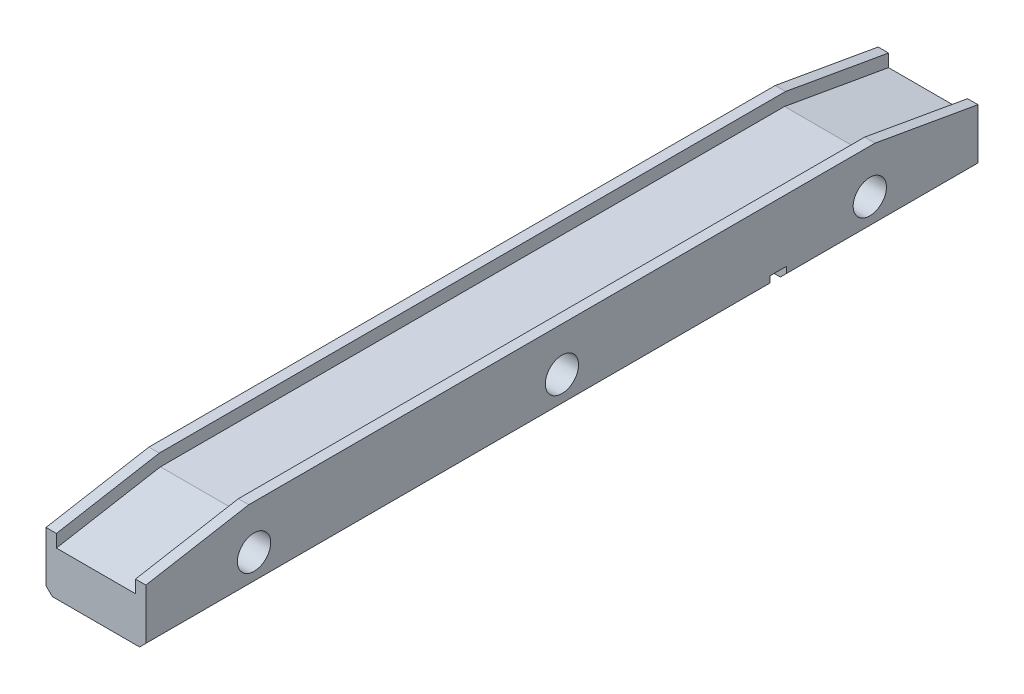
ISO-10303-21;
HEADER;
FILE_DESCRIPTION(('STEP AP214'),'2;1');
FILE_NAME('part.step','',(''),(''),'','','');
FILE_SCHEMA(('AUTOMOTIVE_DESIGN { 1 0 10303 214 1 1 1 1 }'));
ENDSEC;
DATA;
#1=APPLICATION_CONTEXT('core data for automotive mechanical design processes');
#2=APPLICATION_PROTOCOL_DEFINITION('international standard','automotive_design',2000,#1);
#3=PRODUCT_CONTEXT('',#1,'mechanical');
#4=PRODUCT('Part','Part','',(#3));
#5=PRODUCT_RELATED_PRODUCT_CATEGORY('part','',(#4));
#6=PRODUCT_DEFINITION_FORMATION('','',#4);
#7=PRODUCT_DEFINITION_CONTEXT('part definition',#1,'design');
#8=PRODUCT_DEFINITION('design','',#6,#7);
#9=PRODUCT_DEFINITION_SHAPE('','',#8);
#10=(LENGTH_UNIT() NAMED_UNIT(*) SI_UNIT(.MILLI.,.METRE.));
#11=(NAMED_UNIT(*) PLANE_ANGLE_UNIT() SI_UNIT($,.RADIAN.));
#12=(NAMED_UNIT(*) SI_UNIT($,.STERADIAN.) SOLID_ANGLE_UNIT());
#13=UNCERTAINTY_MEASURE_WITH_UNIT(LENGTH_MEASURE(1.E-05),#10,'distance_accuracy_value','');
#14=(GEOMETRIC_REPRESENTATION_CONTEXT(3) GLOBAL_UNCERTAINTY_ASSIGNED_CONTEXT((#13)) GLOBAL_UNIT_ASSIGNED_CONTEXT((#10,
#11,#12)) REPRESENTATION_CONTEXT('',''));
#15=CARTESIAN_POINT('',(0.,0.,0.));
#16=DIRECTION('',(0.,0.,1.));
#17=DIRECTION('',(1.,0.,0.));
#18=AXIS2_PLACEMENT_3D('',#15,#16,#17);
#19=CARTESIAN_POINT('',(24.,-30.,178.));
#20=DIRECTION('',(0.,1.,0.));
#21=DIRECTION('',(0.,0.,1.));
#22=AXIS2_PLACEMENT_3D('',#19,#20,#21);
#23=PLANE('',#22);
#24=DIRECTION('',(1.,0.,0.));
#25=VECTOR('',#24,1.);
#26=CARTESIAN_POINT('',(-24.,-30.,200.));
#27=LINE('',#26,#25);
#28=CARTESIAN_POINT('',(-21.,-30.,200.));
#29=VERTEX_POINT('',#28);
#30=CARTESIAN_POINT('',(21.,-30.,200.));
#31=VERTEX_POINT('',#30);
#32=EDGE_CURVE('E338',#29,#31,#27,.T.);
#33=ORIENTED_EDGE('',*,*,#32,.F.);
#34=DIRECTION('',(0.,0.,-1.));
#35=VECTOR('',#34,1.);
#36=CARTESIAN_POINT('',(-21.,-30.,178.));
#37=LINE('',#36,#35);
#38=CARTESIAN_POINT('',(-21.,-30.,-99.9999999999999));
#39=VERTEX_POINT('',#38);
#40=EDGE_CURVE('E257',#29,#39,#37,.T.);
#41=ORIENTED_EDGE('',*,*,#40,.T.);
#42=DIRECTION('',(1.,0.,0.));
#43=VECTOR('',#42,1.);
#44=CARTESIAN_POINT('',(24.,-30.,-99.9999999999999));
#45=LINE('',#44,#43);
#46=CARTESIAN_POINT('',(21.0000000000001,-30.,-99.9999999999999));
#47=VERTEX_POINT('',#46);
#48=EDGE_CURVE('E319',#39,#47,#45,.T.);
#49=ORIENTED_EDGE('',*,*,#48,.T.);
#50=DIRECTION('',(0.,0.,1.));
#51=VECTOR('',#50,1.);
#52=CARTESIAN_POINT('',(21.0000000000001,-30.,178.));
#53=LINE('',#52,#51);
#54=EDGE_CURVE('E255',#47,#31,#53,.T.);
#55=ORIENTED_EDGE('',*,*,#54,.T.);
#56=EDGE_LOOP('',(#33,#41,#49,#55));
#57=FACE_BOUND('',#56,.T.);
#58=ADVANCED_FACE('F41',(#57),#23,.F.);
#59=CARTESIAN_POINT('',(-24.,6.,178.));
#60=DIRECTION('',(1.,0.,0.));
#61=DIRECTION('',(0.,1.,0.));
#62=AXIS2_PLACEMENT_3D('',#59,#60,#61);
#63=PLANE('',#62);
#64=CARTESIAN_POINT('',(-24.,-15.,0.));
#65=DIRECTION('',(1.,0.,0.));
#66=DIRECTION('',(0.,1.,0.));
#67=AXIS2_PLACEMENT_3D('',#64,#65,#66);
#68=CIRCLE('',#67,8.);
#69=CARTESIAN_POINT('',(-24.,-7.,0.));
#70=VERTEX_POINT('',#69);
#71=EDGE_CURVE('E214',#70,#70,#68,.T.);
#72=ORIENTED_EDGE('',*,*,#71,.T.);
#73=EDGE_LOOP('',(#72));
#74=FACE_BOUND('',#73,.T.);
#75=CARTESIAN_POINT('',(-24.,-15.,148.));
#76=DIRECTION('',(1.,0.,0.));
#77=DIRECTION('',(0.,1.,0.));
#78=AXIS2_PLACEMENT_3D('',#75,#76,#77);
#79=CIRCLE('',#78,8.00000000000001);
#80=CARTESIAN_POINT('',(-24.,-6.99999999999999,148.));
#81=VERTEX_POINT('',#80);
#82=EDGE_CURVE('E356',#81,#81,#79,.T.);
#83=ORIENTED_EDGE('',*,*,#82,.T.);
#84=EDGE_LOOP('',(#83));
#85=FACE_BOUND('',#84,.T.);
#86=CARTESIAN_POINT('',(-24.,-15.,-148.));
#87=DIRECTION('',(1.,0.,0.));
#88=DIRECTION('',(0.,1.,0.));
#89=AXIS2_PLACEMENT_3D('',#86,#87,#88);
#90=CIRCLE('',#89,8.00000000000001);
#91=CARTESIAN_POINT('',(-24.,-6.99999999999999,-148.));
#92=VERTEX_POINT('',#91);
#93=EDGE_CURVE('E351',#92,#92,#90,.T.);
#94=ORIENTED_EDGE('',*,*,#93,.T.);
#95=EDGE_LOOP('',(#94));
#96=FACE_BOUND('',#95,.T.);
#97=DIRECTION('',(0.,-1.,0.));
#98=VECTOR('',#97,1.);
#99=CARTESIAN_POINT('',(-24.,6.00000000000012,-99.9999999999999));
#100=LINE('',#99,#98);
#101=CARTESIAN_POINT('',(-24.,-24.,-99.9999999999999));
#102=VERTEX_POINT('',#101);
#103=CARTESIAN_POINT('',(-24.,-27.,-99.9999999999999));
#104=VERTEX_POINT('',#103);
#105=EDGE_CURVE('E321',#102,#104,#100,.T.);
#106=ORIENTED_EDGE('',*,*,#105,.T.);
#107=DIRECTION('',(0.,0.,1.));
#108=VECTOR('',#107,1.);
#109=CARTESIAN_POINT('',(-24.,-27.,178.));
#110=LINE('',#109,#108);
#111=CARTESIAN_POINT('',(-24.,-27.,200.));
#112=VERTEX_POINT('',#111);
#113=EDGE_CURVE('E266',#104,#112,#110,.T.);
#114=ORIENTED_EDGE('',*,*,#113,.T.);
#115=DIRECTION('',(0.,-1.,0.));
#116=VECTOR('',#115,1.);
#117=CARTESIAN_POINT('',(-24.,6.,200.));
#118=LINE('',#117,#116);
#119=CARTESIAN_POINT('',(-24.,-2.72378936410881,200.));
#120=VERTEX_POINT('',#119);
#121=EDGE_CURVE('E335',#120,#112,#118,.T.);
#122=ORIENTED_EDGE('',*,*,#121,.F.);
#123=DIRECTION('',(0.,0.173648177666927,-0.984807753012209));
#124=VECTOR('',#123,1.);
#125=CARTESIAN_POINT('',(-24.,1.30148664915605,177.171525327027));
#126=LINE('',#125,#124);
#127=CARTESIAN_POINT('',(-24.,6.,150.524931981154));
#128=VERTEX_POINT('',#127);
#129=EDGE_CURVE('E305',#120,#128,#126,.T.);
#130=ORIENTED_EDGE('',*,*,#129,.T.);
#131=DIRECTION('',(0.,0.,-1.));
#132=VECTOR('',#131,1.);
#133=CARTESIAN_POINT('',(-24.,6.,178.));
#134=LINE('',#133,#132);
#135=CARTESIAN_POINT('',(-24.,6.00000000000001,-150.524931981154));
#136=VERTEX_POINT('',#135);
#137=EDGE_CURVE('E359',#128,#136,#134,.T.);
#138=ORIENTED_EDGE('',*,*,#137,.T.);
#139=DIRECTION('',(0.,-0.173648177666927,-0.984807753012209));
#140=VECTOR('',#139,1.);
#141=CARTESIAN_POINT('',(-24.,62.181072161124,168.093761172865));
#142=LINE('',#141,#140);
#143=CARTESIAN_POINT('',(-24.,-2.72378936410881,-200.));
#144=VERTEX_POINT('',#143);
#145=EDGE_CURVE('E400',#136,#144,#142,.T.);
#146=ORIENTED_EDGE('',*,*,#145,.T.);
#147=DIRECTION('',(0.,1.,0.));
#148=VECTOR('',#147,1.);
#149=CARTESIAN_POINT('',(-24.,-30.,-200.));
#150=LINE('',#149,#148);
#151=CARTESIAN_POINT('',(-24.,-27.,-200.));
#152=VERTEX_POINT('',#151);
#153=EDGE_CURVE('E327',#152,#144,#150,.T.);
#154=ORIENTED_EDGE('',*,*,#153,.F.);
#155=DIRECTION('',(0.,0.,1.));
#156=VECTOR('',#155,1.);
#157=CARTESIAN_POINT('',(-24.,-27.,178.));
#158=LINE('',#157,#156);
#159=CARTESIAN_POINT('',(-24.,-27.,-108.));
#160=VERTEX_POINT('',#159);
#161=EDGE_CURVE('E264',#152,#160,#158,.T.);
#162=ORIENTED_EDGE('',*,*,#161,.T.);
#163=DIRECTION('',(0.,1.,0.));
#164=VECTOR('',#163,1.);
#165=CARTESIAN_POINT('',(-24.,6.,-108.));
#166=LINE('',#165,#164);
#167=CARTESIAN_POINT('',(-24.,-24.,-108.));
#168=VERTEX_POINT('',#167);
#169=EDGE_CURVE('E314',#160,#168,#166,.T.);
#170=ORIENTED_EDGE('',*,*,#169,.T.);
#171=DIRECTION('',(0.,0.,1.));
#172=VECTOR('',#171,1.);
#173=CARTESIAN_POINT('',(-24.,-24.,178.));
#174=LINE('',#173,#172);
#175=EDGE_CURVE('E316',#168,#102,#174,.T.);
#176=ORIENTED_EDGE('',*,*,#175,.T.);
#177=EDGE_LOOP('',(#106,#114,#122,#130,#138,#146,#154,#162,#170,#176));
#178=FACE_BOUND('',#177,.T.);
#179=ADVANCED_FACE('F419',(#74,#85,#96,#178),#63,.F.);
#180=DIRECTION('',(-1.,0.,0.));
#181=VECTOR('',#180,1.);
#182=CARTESIAN_POINT('',(24.,-30.,-108.));
#183=LINE('',#182,#181);
#184=CARTESIAN_POINT('',(21.0000000000001,-30.,-108.));
#185=VERTEX_POINT('',#184);
#186=CARTESIAN_POINT('',(-21.,-30.,-108.));
#187=VERTEX_POINT('',#186);
#188=EDGE_CURVE('E310',#185,#187,#183,.T.);
#189=ORIENTED_EDGE('',*,*,#188,.T.);
#190=DIRECTION('',(0.,0.,-1.));
#191=VECTOR('',#190,1.);
#192=CARTESIAN_POINT('',(-21.,-30.,178.));
#193=LINE('',#192,#191);
#194=CARTESIAN_POINT('',(-21.,-30.,-200.));
#195=VERTEX_POINT('',#194);
#196=EDGE_CURVE('E274',#187,#195,#193,.T.);
#197=ORIENTED_EDGE('',*,*,#196,.T.);
#198=DIRECTION('',(-1.,0.,0.));
#199=VECTOR('',#198,1.);
#200=CARTESIAN_POINT('',(24.,-30.,-200.));
#201=LINE('',#200,#199);
#202=CARTESIAN_POINT('',(21.0000000000001,-30.,-200.));
#203=VERTEX_POINT('',#202);
#204=EDGE_CURVE('E324',#203,#195,#201,.T.);
#205=ORIENTED_EDGE('',*,*,#204,.F.);
#206=DIRECTION('',(0.,0.,1.));
#207=VECTOR('',#206,1.);
#208=CARTESIAN_POINT('',(21.0000000000001,-30.,178.));
#209=LINE('',#208,#207);
#210=EDGE_CURVE('E272',#203,#185,#209,.T.);
#211=ORIENTED_EDGE('',*,*,#210,.T.);
#212=EDGE_LOOP('',(#189,#197,#205,#211));
#213=FACE_BOUND('',#212,.T.);
#214=ADVANCED_FACE('F444',(#213),#23,.F.);
#215=CARTESIAN_POINT('',(24.,6.,178.));
#216=DIRECTION('',(-1.,0.,0.));
#217=DIRECTION('',(0.,-1.,0.));
#218=AXIS2_PLACEMENT_3D('',#215,#216,#217);
#219=PLANE('',#218);
#220=CARTESIAN_POINT('',(24.,-15.,0.));
#221=DIRECTION('',(1.,0.,0.));
#222=DIRECTION('',(0.,1.,0.));
#223=AXIS2_PLACEMENT_3D('',#220,#221,#222);
#224=CIRCLE('',#223,8.);
#225=CARTESIAN_POINT('',(24.,-7.,0.));
#226=VERTEX_POINT('',#225);
#227=EDGE_CURVE('E811',#226,#226,#224,.T.);
#228=ORIENTED_EDGE('',*,*,#227,.F.);
#229=EDGE_LOOP('',(#228));
#230=FACE_BOUND('',#229,.T.);
#231=CARTESIAN_POINT('',(24.,-15.,148.));
#232=DIRECTION('',(1.,0.,0.));
#233=DIRECTION('',(0.,1.,0.));
#234=AXIS2_PLACEMENT_3D('',#231,#232,#233);
#235=CIRCLE('',#234,8.00000000000001);
#236=CARTESIAN_POINT('',(24.,-6.99999999999999,148.));
#237=VERTEX_POINT('',#236);
#238=EDGE_CURVE('E348',#237,#237,#235,.T.);
#239=ORIENTED_EDGE('',*,*,#238,.F.);
#240=EDGE_LOOP('',(#239));
#241=FACE_BOUND('',#240,.T.);
#242=CARTESIAN_POINT('',(24.,-15.,-148.));
#243=DIRECTION('',(1.,0.,0.));
#244=DIRECTION('',(0.,1.,0.));
#245=AXIS2_PLACEMENT_3D('',#242,#243,#244);
#246=CIRCLE('',#245,8.00000000000001);
#247=CARTESIAN_POINT('',(24.,-6.99999999999999,-148.));
#248=VERTEX_POINT('',#247);
#249=EDGE_CURVE('E347',#248,#248,#246,.T.);
#250=ORIENTED_EDGE('',*,*,#249,.F.);
#251=EDGE_LOOP('',(#250));
#252=FACE_BOUND('',#251,.T.);
#253=DIRECTION('',(0.,-1.,0.));
#254=VECTOR('',#253,1.);
#255=CARTESIAN_POINT('',(24.,6.,-108.));
#256=LINE('',#255,#254);
#257=CARTESIAN_POINT('',(24.,-24.,-108.));
#258=VERTEX_POINT('',#257);
#259=CARTESIAN_POINT('',(24.,-27.0000000000001,-108.));
#260=VERTEX_POINT('',#259);
#261=EDGE_CURVE('E219',#258,#260,#256,.T.);
#262=ORIENTED_EDGE('',*,*,#261,.T.);
#263=DIRECTION('',(0.,0.,-1.));
#264=VECTOR('',#263,1.);
#265=CARTESIAN_POINT('',(24.,-27.0000000000001,178.));
#266=LINE('',#265,#264);
#267=CARTESIAN_POINT('',(24.,-27.0000000000001,-200.));
#268=VERTEX_POINT('',#267);
#269=EDGE_CURVE('E11',#260,#268,#266,.T.);
#270=ORIENTED_EDGE('',*,*,#269,.T.);
#271=DIRECTION('',(0.,-1.,0.));
#272=VECTOR('',#271,1.);
#273=CARTESIAN_POINT('',(24.,6.,-200.));
#274=LINE('',#273,#272);
#275=CARTESIAN_POINT('',(24.,-2.72378936410881,-200.));
#276=VERTEX_POINT('',#275);
#277=EDGE_CURVE('E212',#276,#268,#274,.T.);
#278=ORIENTED_EDGE('',*,*,#277,.F.);
#279=DIRECTION('',(0.,-0.173648177666927,-0.984807753012209));
#280=VECTOR('',#279,1.);
#281=CARTESIAN_POINT('',(24.,-2.90750251735002,-201.041889066002));
#282=LINE('',#281,#280);
#283=CARTESIAN_POINT('',(24.,6.00000000000001,-150.524931981154));
#284=VERTEX_POINT('',#283);
#285=EDGE_CURVE('E195',#284,#276,#282,.T.);
#286=ORIENTED_EDGE('',*,*,#285,.F.);
#287=DIRECTION('',(0.,0.,-1.));
#288=VECTOR('',#287,1.);
#289=CARTESIAN_POINT('',(24.,6.,178.));
#290=LINE('',#289,#288);
#291=CARTESIAN_POINT('',(24.,6.,150.524931981154));
#292=VERTEX_POINT('',#291);
#293=EDGE_CURVE('E210',#292,#284,#290,.T.);
#294=ORIENTED_EDGE('',*,*,#293,.F.);
#295=DIRECTION('',(0.,0.173648177666927,-0.984807753012209));
#296=VECTOR('',#295,1.);
#297=CARTESIAN_POINT('',(24.,-2.90750251735002,201.041889066002));
#298=LINE('',#297,#296);
#299=CARTESIAN_POINT('',(24.,-2.72378936410881,200.));
#300=VERTEX_POINT('',#299);
#301=EDGE_CURVE('E213',#300,#292,#298,.T.);
#302=ORIENTED_EDGE('',*,*,#301,.F.);
#303=DIRECTION('',(0.,1.,0.));
#304=VECTOR('',#303,1.);
#305=CARTESIAN_POINT('',(24.,-30.,200.));
#306=LINE('',#305,#304);
#307=CARTESIAN_POINT('',(24.,-27.0000000000001,200.));
#308=VERTEX_POINT('',#307);
#309=EDGE_CURVE('E289',#308,#300,#306,.T.);
#310=ORIENTED_EDGE('',*,*,#309,.F.);
#311=DIRECTION('',(0.,0.,-1.));
#312=VECTOR('',#311,1.);
#313=CARTESIAN_POINT('',(24.,-27.0000000000001,178.));
#314=LINE('',#313,#312);
#315=CARTESIAN_POINT('',(24.,-27.0000000000001,-99.9999999999999));
#316=VERTEX_POINT('',#315);
#317=EDGE_CURVE('E50',#308,#316,#314,.T.);
#318=ORIENTED_EDGE('',*,*,#317,.T.);
#319=DIRECTION('',(0.,-1.,0.));
#320=VECTOR('',#319,1.);
#321=CARTESIAN_POINT('',(24.,-24.,-99.9999999999999));
#322=LINE('',#321,#320);
#323=CARTESIAN_POINT('',(24.,-24.,-99.9999999999999));
#324=VERTEX_POINT('',#323);
#325=EDGE_CURVE('E288',#324,#316,#322,.T.);
#326=ORIENTED_EDGE('',*,*,#325,.F.);
#327=DIRECTION('',(0.,0.,1.));
#328=VECTOR('',#327,1.);
#329=CARTESIAN_POINT('',(24.,-24.,-99.9999999999999));
#330=LINE('',#329,#328);
#331=EDGE_CURVE('E299',#258,#324,#330,.T.);
#332=ORIENTED_EDGE('',*,*,#331,.F.);
#333=EDGE_LOOP('',(#262,#270,#278,#286,#294,#302,#310,#318,#326,#332));
#334=FACE_BOUND('',#333,.T.);
#335=ADVANCED_FACE('F208',(#230,#241,#252,#334),#219,.F.);
#336=CARTESIAN_POINT('',(19.,6.,178.));
#337=DIRECTION('',(0.,-1.,0.));
#338=DIRECTION('',(0.,0.,-1.));
#339=AXIS2_PLACEMENT_3D('',#336,#337,#338);
#340=PLANE('',#339);
#341=DIRECTION('',(0.,0.,-1.));
#342=VECTOR('',#341,1.);
#343=CARTESIAN_POINT('',(19.,6.,178.));
#344=LINE('',#343,#342);
#345=CARTESIAN_POINT('',(19.,6.,150.524931981154));
#346=VERTEX_POINT('',#345);
#347=CARTESIAN_POINT('',(19.,6.,-150.524931981154));
#348=VERTEX_POINT('',#347);
#349=EDGE_CURVE('E220',#346,#348,#344,.T.);
#350=ORIENTED_EDGE('',*,*,#349,.F.);
#351=DIRECTION('',(1.,0.,0.));
#352=VECTOR('',#351,1.);
#353=CARTESIAN_POINT('',(19.,6.,150.524931981154));
#354=LINE('',#353,#352);
#355=EDGE_CURVE('E218',#346,#292,#354,.T.);
#356=ORIENTED_EDGE('',*,*,#355,.T.);
#357=ORIENTED_EDGE('',*,*,#293,.T.);
#358=DIRECTION('',(-1.,0.,0.));
#359=VECTOR('',#358,1.);
#360=CARTESIAN_POINT('',(18.9999999999998,6.,-150.524931981154));
#361=LINE('',#360,#359);
#362=EDGE_CURVE('E192',#284,#348,#361,.T.);
#363=ORIENTED_EDGE('',*,*,#362,.T.);
#364=EDGE_LOOP('',(#350,#356,#357,#363));
#365=FACE_BOUND('',#364,.T.);
#366=ADVANCED_FACE('F217',(#365),#340,.F.);
#367=CARTESIAN_POINT('',(19.,0.,178.));
#368=DIRECTION('',(1.,0.,0.));
#369=DIRECTION('',(0.,0.,-1.));
#370=AXIS2_PLACEMENT_3D('',#367,#368,#369);
#371=PLANE('',#370);
#372=DIRECTION('',(0.,-1.,0.));
#373=VECTOR('',#372,1.);
#374=CARTESIAN_POINT('',(19.,6.,200.));
#375=LINE('',#374,#373);
#376=CARTESIAN_POINT('',(19.,-2.72378936410881,200.));
#377=VERTEX_POINT('',#376);
#378=CARTESIAN_POINT('',(19.,-8.81634903542328,200.));
#379=VERTEX_POINT('',#378);
#380=EDGE_CURVE('E342',#377,#379,#375,.T.);
#381=ORIENTED_EDGE('',*,*,#380,.F.);
#382=DIRECTION('',(0.,0.173648177666927,-0.984807753012209));
#383=VECTOR('',#382,1.);
#384=CARTESIAN_POINT('',(19.,1.12056451151379,178.197585757004));
#385=LINE('',#384,#383);
#386=EDGE_CURVE('E203',#377,#346,#385,.T.);
#387=ORIENTED_EDGE('',*,*,#386,.T.);
#388=ORIENTED_EDGE('',*,*,#349,.T.);
#389=DIRECTION('',(0.,-0.173648177666927,-0.984807753012209));
#390=VECTOR('',#389,1.);
#391=CARTESIAN_POINT('',(19.,62.0001500234817,167.067700742888));
#392=LINE('',#391,#390);
#393=CARTESIAN_POINT('',(19.,-2.72378936410881,-200.));
#394=VERTEX_POINT('',#393);
#395=EDGE_CURVE('E198',#348,#394,#392,.T.);
#396=ORIENTED_EDGE('',*,*,#395,.T.);
#397=DIRECTION('',(0.,1.,0.));
#398=VECTOR('',#397,1.);
#399=CARTESIAN_POINT('',(19.,0.,-200.));
#400=LINE('',#399,#398);
#401=CARTESIAN_POINT('',(19.,-8.81634903542328,-200.));
#402=VERTEX_POINT('',#401);
#403=EDGE_CURVE('E331',#402,#394,#400,.T.);
#404=ORIENTED_EDGE('',*,*,#403,.F.);
#405=DIRECTION('',(0.,0.173648177666927,0.984807753012209));
#406=VECTOR('',#405,1.);
#407=CARTESIAN_POINT('',(19.,56.0913035054085,168.109589808889));
#408=LINE('',#407,#406);
#409=CARTESIAN_POINT('',(19.,0.,-149.999999999999));
#410=VERTEX_POINT('',#409);
#411=EDGE_CURVE('E237',#402,#410,#408,.T.);
#412=ORIENTED_EDGE('',*,*,#411,.T.);
#413=DIRECTION('',(0.,0.,-1.));
#414=VECTOR('',#413,1.);
#415=CARTESIAN_POINT('',(19.,0.,178.));
#416=LINE('',#415,#414);
#417=CARTESIAN_POINT('',(19.,0.,149.999999999999));
#418=VERTEX_POINT('',#417);
#419=EDGE_CURVE('E224',#418,#410,#416,.T.);
#420=ORIENTED_EDGE('',*,*,#419,.F.);
#421=DIRECTION('',(0.,-0.173648177666927,0.984807753012209));
#422=VECTOR('',#421,1.);
#423=CARTESIAN_POINT('',(19.,-4.78828200655947,177.155696691003));
#424=LINE('',#423,#422);
#425=EDGE_CURVE('E244',#418,#379,#424,.T.);
#426=ORIENTED_EDGE('',*,*,#425,.T.);
#427=EDGE_LOOP('',(#381,#387,#388,#396,#404,#412,#420,#426));
#428=FACE_BOUND('',#427,.T.);
#429=ADVANCED_FACE('F391',(#428),#371,.F.);
#430=CARTESIAN_POINT('',(-19.,0.,178.));
#431=DIRECTION('',(0.,-1.,0.));
#432=DIRECTION('',(0.,0.,-1.));
#433=AXIS2_PLACEMENT_3D('',#430,#431,#432);
#434=PLANE('',#433);
#435=ORIENTED_EDGE('',*,*,#419,.T.);
#436=DIRECTION('',(-1.,0.,0.));
#437=VECTOR('',#436,1.);
#438=CARTESIAN_POINT('',(-19.,0.,-149.999999999999));
#439=LINE('',#438,#437);
#440=CARTESIAN_POINT('',(-19.,0.,-149.999999999999));
#441=VERTEX_POINT('',#440);
#442=EDGE_CURVE('E232',#410,#441,#439,.T.);
#443=ORIENTED_EDGE('',*,*,#442,.T.);
#444=DIRECTION('',(0.,0.,-1.));
#445=VECTOR('',#444,1.);
#446=CARTESIAN_POINT('',(-19.,0.,178.));
#447=LINE('',#446,#445);
#448=CARTESIAN_POINT('',(-19.,0.,149.999999999999));
#449=VERTEX_POINT('',#448);
#450=EDGE_CURVE('E365',#449,#441,#447,.T.);
#451=ORIENTED_EDGE('',*,*,#450,.F.);
#452=DIRECTION('',(1.,0.,0.));
#453=VECTOR('',#452,1.);
#454=CARTESIAN_POINT('',(19.,0.,149.999999999999));
#455=LINE('',#454,#453);
#456=EDGE_CURVE('E230',#449,#418,#455,.T.);
#457=ORIENTED_EDGE('',*,*,#456,.T.);
#458=EDGE_LOOP('',(#435,#443,#451,#457));
#459=FACE_BOUND('',#458,.T.);
#460=ADVANCED_FACE('F371',(#459),#434,.F.);
#461=CARTESIAN_POINT('',(-19.,0.,178.));
#462=DIRECTION('',(-1.,0.,0.));
#463=DIRECTION('',(0.,0.,1.));
#464=AXIS2_PLACEMENT_3D('',#461,#462,#463);
#465=PLANE('',#464);
#466=DIRECTION('',(0.,0.,-1.));
#467=VECTOR('',#466,1.);
#468=CARTESIAN_POINT('',(-19.,6.,178.));
#469=LINE('',#468,#467);
#470=CARTESIAN_POINT('',(-19.,6.,150.524931981154));
#471=VERTEX_POINT('',#470);
#472=CARTESIAN_POINT('',(-19.,6.,-150.524931981154));
#473=VERTEX_POINT('',#472);
#474=EDGE_CURVE('E362',#471,#473,#469,.T.);
#475=ORIENTED_EDGE('',*,*,#474,.F.);
#476=DIRECTION('',(0.,-0.173648177666927,0.984807753012209));
#477=VECTOR('',#476,1.);
#478=CARTESIAN_POINT('',(-19.,1.12056451151378,178.197585757004));
#479=LINE('',#478,#477);
#480=CARTESIAN_POINT('',(-19.,-2.72378936410881,200.));
#481=VERTEX_POINT('',#480);
#482=EDGE_CURVE('E413',#471,#481,#479,.T.);
#483=ORIENTED_EDGE('',*,*,#482,.T.);
#484=DIRECTION('',(0.,1.,0.));
#485=VECTOR('',#484,1.);
#486=CARTESIAN_POINT('',(-19.,0.,200.));
#487=LINE('',#486,#485);
#488=CARTESIAN_POINT('',(-19.,-8.81634903542328,200.));
#489=VERTEX_POINT('',#488);
#490=EDGE_CURVE('E344',#489,#481,#487,.T.);
#491=ORIENTED_EDGE('',*,*,#490,.F.);
#492=DIRECTION('',(0.,0.173648177666927,-0.984807753012209));
#493=VECTOR('',#492,1.);
#494=CARTESIAN_POINT('',(-19.,-4.78828200655947,177.155696691003));
#495=LINE('',#494,#493);
#496=EDGE_CURVE('E242',#489,#449,#495,.T.);
#497=ORIENTED_EDGE('',*,*,#496,.T.);
#498=ORIENTED_EDGE('',*,*,#450,.T.);
#499=DIRECTION('',(0.,-0.173648177666927,-0.984807753012209));
#500=VECTOR('',#499,1.);
#501=CARTESIAN_POINT('',(-19.,56.0913035054085,168.109589808889));
#502=LINE('',#501,#500);
#503=CARTESIAN_POINT('',(-19.,-8.81634903542328,-200.));
#504=VERTEX_POINT('',#503);
#505=EDGE_CURVE('E239',#441,#504,#502,.T.);
#506=ORIENTED_EDGE('',*,*,#505,.T.);
#507=DIRECTION('',(0.,-1.,0.));
#508=VECTOR('',#507,1.);
#509=CARTESIAN_POINT('',(-19.,6.,-200.));
#510=LINE('',#509,#508);
#511=CARTESIAN_POINT('',(-19.,-2.72378936410881,-200.));
#512=VERTEX_POINT('',#511);
#513=EDGE_CURVE('E329',#512,#504,#510,.T.);
#514=ORIENTED_EDGE('',*,*,#513,.F.);
#515=DIRECTION('',(0.,0.173648177666927,0.984807753012209));
#516=VECTOR('',#515,1.);
#517=CARTESIAN_POINT('',(-19.,62.0001500234817,167.067700742888));
#518=LINE('',#517,#516);
#519=EDGE_CURVE('E398',#512,#473,#518,.T.);
#520=ORIENTED_EDGE('',*,*,#519,.T.);
#521=EDGE_LOOP('',(#475,#483,#491,#497,#498,#506,#514,#520));
#522=FACE_BOUND('',#521,.T.);
#523=ADVANCED_FACE('F384',(#522),#465,.F.);
#524=CARTESIAN_POINT('',(-19.,6.,178.));
#525=DIRECTION('',(0.,-1.,0.));
#526=DIRECTION('',(0.,0.,-1.));
#527=AXIS2_PLACEMENT_3D('',#524,#525,#526);
#528=PLANE('',#527);
#529=ORIENTED_EDGE('',*,*,#137,.F.);
#530=DIRECTION('',(1.,0.,0.));
#531=VECTOR('',#530,1.);
#532=CARTESIAN_POINT('',(-19.,6.,150.524931981154));
#533=LINE('',#532,#531);
#534=EDGE_CURVE('E300',#128,#471,#533,.T.);
#535=ORIENTED_EDGE('',*,*,#534,.T.);
#536=ORIENTED_EDGE('',*,*,#474,.T.);
#537=DIRECTION('',(-1.,0.,0.));
#538=VECTOR('',#537,1.);
#539=CARTESIAN_POINT('',(-19.0000000000002,6.,-150.524931981154));
#540=LINE('',#539,#538);
#541=EDGE_CURVE('E407',#473,#136,#540,.T.);
#542=ORIENTED_EDGE('',*,*,#541,.T.);
#543=EDGE_LOOP('',(#529,#535,#536,#542));
#544=FACE_BOUND('',#543,.T.);
#545=ADVANCED_FACE('F423',(#544),#528,.F.);
#546=CARTESIAN_POINT('',(-631.,-15.0000000000001,-148.));
#547=DIRECTION('',(1.,0.,0.));
#548=DIRECTION('',(0.,1.,0.));
#549=AXIS2_PLACEMENT_3D('',#546,#547,#548);
#550=CYLINDRICAL_SURFACE('',#549,8.00000000000001);
#551=ORIENTED_EDGE('',*,*,#249,.T.);
#552=EDGE_LOOP('',(#551));
#553=FACE_BOUND('',#552,.T.);
#554=ORIENTED_EDGE('',*,*,#93,.F.);
#555=EDGE_LOOP('',(#554));
#556=FACE_BOUND('',#555,.T.);
#557=ADVANCED_FACE('F524',(#553,#556),#550,.F.);
#558=CARTESIAN_POINT('',(-631.,-15.0000000000001,148.));
#559=DIRECTION('',(1.,0.,0.));
#560=DIRECTION('',(0.,1.,0.));
#561=AXIS2_PLACEMENT_3D('',#558,#559,#560);
#562=CYLINDRICAL_SURFACE('',#561,8.00000000000001);
#563=ORIENTED_EDGE('',*,*,#238,.T.);
#564=EDGE_LOOP('',(#563));
#565=FACE_BOUND('',#564,.T.);
#566=ORIENTED_EDGE('',*,*,#82,.F.);
#567=EDGE_LOOP('',(#566));
#568=FACE_BOUND('',#567,.T.);
#569=ADVANCED_FACE('F521',(#565,#568),#562,.F.);
#570=CARTESIAN_POINT('',(0.,0.,200.));
#571=DIRECTION('',(0.,0.,1.));
#572=DIRECTION('',(1.,0.,0.));
#573=AXIS2_PLACEMENT_3D('',#570,#571,#572);
#574=PLANE('',#573);
#575=ORIENTED_EDGE('',*,*,#121,.T.);
#576=DIRECTION('',(-0.707106781186549,0.707106781186546,0.));
#577=VECTOR('',#576,1.);
#578=CARTESIAN_POINT('',(-25.5,-25.5000000000001,200.));
#579=LINE('',#578,#577);
#580=EDGE_CURVE('E270',#112,#29,#579,.F.);
#581=ORIENTED_EDGE('',*,*,#580,.T.);
#582=ORIENTED_EDGE('',*,*,#32,.T.);
#583=DIRECTION('',(-0.707106781186548,-0.707106781186547,0.));
#584=VECTOR('',#583,1.);
#585=CARTESIAN_POINT('',(25.5,-25.5000000000001,200.));
#586=LINE('',#585,#584);
#587=EDGE_CURVE('E268',#31,#308,#586,.F.);
#588=ORIENTED_EDGE('',*,*,#587,.T.);
#589=ORIENTED_EDGE('',*,*,#309,.T.);
#590=DIRECTION('',(1.,0.,0.));
#591=VECTOR('',#590,1.);
#592=CARTESIAN_POINT('',(0.,-2.72378936410881,200.));
#593=LINE('',#592,#591);
#594=EDGE_CURVE('E251',#377,#300,#593,.T.);
#595=ORIENTED_EDGE('',*,*,#594,.F.);
#596=ORIENTED_EDGE('',*,*,#380,.T.);
#597=DIRECTION('',(-1.,0.,0.));
#598=VECTOR('',#597,1.);
#599=CARTESIAN_POINT('',(-19.,-8.81634903542328,200.));
#600=LINE('',#599,#598);
#601=EDGE_CURVE('E234',#379,#489,#600,.T.);
#602=ORIENTED_EDGE('',*,*,#601,.T.);
#603=ORIENTED_EDGE('',*,*,#490,.T.);
#604=EDGE_CURVE('E254',#120,#481,#593,.T.);
#605=ORIENTED_EDGE('',*,*,#604,.F.);
#606=EDGE_LOOP('',(#575,#581,#582,#588,#589,#595,#596,#602,#603,#605));
#607=FACE_BOUND('',#606,.T.);
#608=ADVANCED_FACE('F395',(#607),#574,.T.);
#609=CARTESIAN_POINT('',(0.,0.,-200.));
#610=DIRECTION('',(0.,0.,-1.));
#611=DIRECTION('',(-1.,0.,0.));
#612=AXIS2_PLACEMENT_3D('',#609,#610,#611);
#613=PLANE('',#612);
#614=ORIENTED_EDGE('',*,*,#204,.T.);
#615=DIRECTION('',(0.707106781186549,-0.707106781186546,0.));
#616=VECTOR('',#615,1.);
#617=CARTESIAN_POINT('',(-25.5,-25.5000000000001,-200.));
#618=LINE('',#617,#616);
#619=EDGE_CURVE('E278',#195,#152,#618,.F.);
#620=ORIENTED_EDGE('',*,*,#619,.T.);
#621=ORIENTED_EDGE('',*,*,#153,.T.);
#622=DIRECTION('',(-1.,0.,0.));
#623=VECTOR('',#622,1.);
#624=CARTESIAN_POINT('',(0.,-2.72378936410881,-200.));
#625=LINE('',#624,#623);
#626=EDGE_CURVE('E247',#512,#144,#625,.T.);
#627=ORIENTED_EDGE('',*,*,#626,.F.);
#628=ORIENTED_EDGE('',*,*,#513,.T.);
#629=DIRECTION('',(1.,0.,0.));
#630=VECTOR('',#629,1.);
#631=CARTESIAN_POINT('',(19.,-8.81634903542328,-200.));
#632=LINE('',#631,#630);
#633=EDGE_CURVE('E222',#504,#402,#632,.T.);
#634=ORIENTED_EDGE('',*,*,#633,.T.);
#635=ORIENTED_EDGE('',*,*,#403,.T.);
#636=EDGE_CURVE('E250',#276,#394,#625,.T.);
#637=ORIENTED_EDGE('',*,*,#636,.F.);
#638=ORIENTED_EDGE('',*,*,#277,.T.);
#639=DIRECTION('',(0.707106781186548,0.707106781186547,0.));
#640=VECTOR('',#639,1.);
#641=CARTESIAN_POINT('',(25.5,-25.5000000000001,-200.));
#642=LINE('',#641,#640);
#643=EDGE_CURVE('E65',#268,#203,#642,.F.);
#644=ORIENTED_EDGE('',*,*,#643,.T.);
#645=EDGE_LOOP('',(#614,#620,#621,#627,#628,#634,#635,#637,#638,#644));
#646=FACE_BOUND('',#645,.T.);
#647=ADVANCED_FACE('F465',(#646),#613,.T.);
#648=CARTESIAN_POINT('',(-65.,-24.,-99.9999999999999));
#649=DIRECTION('',(0.,0.,1.));
#650=DIRECTION('',(0.,-1.,0.));
#651=AXIS2_PLACEMENT_3D('',#648,#649,#650);
#652=PLANE('',#651);
#653=ORIENTED_EDGE('',*,*,#48,.F.);
#654=DIRECTION('',(0.707106781186549,-0.707106781186546,0.));
#655=VECTOR('',#654,1.);
#656=CARTESIAN_POINT('',(-21.0000000000001,-30.,-99.9999999999999));
#657=LINE('',#656,#655);
#658=EDGE_CURVE('E262',#39,#104,#657,.F.);
#659=ORIENTED_EDGE('',*,*,#658,.T.);
#660=ORIENTED_EDGE('',*,*,#105,.F.);
#661=DIRECTION('',(1.,0.,0.));
#662=VECTOR('',#661,1.);
#663=CARTESIAN_POINT('',(-65.,-24.,-99.9999999999999));
#664=LINE('',#663,#662);
#665=EDGE_CURVE('E297',#102,#324,#664,.T.);
#666=ORIENTED_EDGE('',*,*,#665,.T.);
#667=ORIENTED_EDGE('',*,*,#325,.T.);
#668=DIRECTION('',(0.707106781186548,0.707106781186547,0.));
#669=VECTOR('',#668,1.);
#670=CARTESIAN_POINT('',(24.0000000000001,-27.,-99.9999999999999));
#671=LINE('',#670,#669);
#672=EDGE_CURVE('E260',#316,#47,#671,.F.);
#673=ORIENTED_EDGE('',*,*,#672,.T.);
#674=EDGE_LOOP('',(#653,#659,#660,#666,#667,#673));
#675=FACE_BOUND('',#674,.T.);
#676=ADVANCED_FACE('F294',(#675),#652,.F.);
#677=CARTESIAN_POINT('',(-65.,-24.,-99.9999999999999));
#678=DIRECTION('',(0.,1.,0.));
#679=DIRECTION('',(-1.,0.,0.));
#680=AXIS2_PLACEMENT_3D('',#677,#678,#679);
#681=PLANE('',#680);
#682=DIRECTION('',(1.,0.,0.));
#683=VECTOR('',#682,1.);
#684=CARTESIAN_POINT('',(-65.,-24.,-108.));
#685=LINE('',#684,#683);
#686=EDGE_CURVE('E302',#168,#258,#685,.T.);
#687=ORIENTED_EDGE('',*,*,#686,.T.);
#688=ORIENTED_EDGE('',*,*,#331,.T.);
#689=ORIENTED_EDGE('',*,*,#665,.F.);
#690=ORIENTED_EDGE('',*,*,#175,.F.);
#691=EDGE_LOOP('',(#687,#688,#689,#690));
#692=FACE_BOUND('',#691,.T.);
#693=ADVANCED_FACE('F471',(#692),#681,.F.);
#694=CARTESIAN_POINT('',(-65.,-24.,-108.));
#695=DIRECTION('',(0.,0.,-1.));
#696=DIRECTION('',(-1.,0.,0.));
#697=AXIS2_PLACEMENT_3D('',#694,#695,#696);
#698=PLANE('',#697);
#699=ORIENTED_EDGE('',*,*,#169,.F.);
#700=DIRECTION('',(-0.707106781186549,0.707106781186546,0.));
#701=VECTOR('',#700,1.);
#702=CARTESIAN_POINT('',(-21.,-30.,-108.));
#703=LINE('',#702,#701);
#704=EDGE_CURVE('E281',#160,#187,#703,.F.);
#705=ORIENTED_EDGE('',*,*,#704,.T.);
#706=ORIENTED_EDGE('',*,*,#188,.F.);
#707=DIRECTION('',(-0.707106781186548,-0.707106781186547,0.));
#708=VECTOR('',#707,1.);
#709=CARTESIAN_POINT('',(24.,-27.0000000000001,-108.));
#710=LINE('',#709,#708);
#711=EDGE_CURVE('E57',#185,#260,#710,.F.);
#712=ORIENTED_EDGE('',*,*,#711,.T.);
#713=ORIENTED_EDGE('',*,*,#261,.F.);
#714=ORIENTED_EDGE('',*,*,#686,.F.);
#715=EDGE_LOOP('',(#699,#705,#706,#712,#713,#714));
#716=FACE_BOUND('',#715,.T.);
#717=ADVANCED_FACE('F469',(#716),#698,.F.);
#718=CARTESIAN_POINT('',(0.,-8.81634903542328,-200.));
#719=DIRECTION('',(0.,0.984807753012209,-0.173648177666927));
#720=DIRECTION('',(-1.,0.,0.));
#721=AXIS2_PLACEMENT_3D('',#718,#719,#720);
#722=PLANE('',#721);
#723=ORIENTED_EDGE('',*,*,#505,.F.);
#724=ORIENTED_EDGE('',*,*,#442,.F.);
#725=ORIENTED_EDGE('',*,*,#411,.F.);
#726=ORIENTED_EDGE('',*,*,#633,.F.);
#727=EDGE_LOOP('',(#723,#724,#725,#726));
#728=FACE_BOUND('',#727,.T.);
#729=ADVANCED_FACE('F379',(#728),#722,.T.);
#730=CARTESIAN_POINT('',(0.,-8.81634903542328,200.));
#731=DIRECTION('',(0.,0.984807753012209,0.173648177666927));
#732=DIRECTION('',(1.,0.,0.));
#733=AXIS2_PLACEMENT_3D('',#730,#731,#732);
#734=PLANE('',#733);
#735=ORIENTED_EDGE('',*,*,#425,.F.);
#736=ORIENTED_EDGE('',*,*,#456,.F.);
#737=ORIENTED_EDGE('',*,*,#496,.F.);
#738=ORIENTED_EDGE('',*,*,#601,.F.);
#739=EDGE_LOOP('',(#735,#736,#737,#738));
#740=FACE_BOUND('',#739,.T.);
#741=ADVANCED_FACE('F388',(#740),#734,.T.);
#742=CARTESIAN_POINT('',(-84.,-2.90750251735003,-201.041889066002));
#743=DIRECTION('',(0.,-0.984807753012209,0.173648177666927));
#744=DIRECTION('',(0.,-0.173648177666927,-0.984807753012209));
#745=AXIS2_PLACEMENT_3D('',#742,#743,#744);
#746=PLANE('',#745);
#747=ORIENTED_EDGE('',*,*,#519,.F.);
#748=ORIENTED_EDGE('',*,*,#626,.T.);
#749=ORIENTED_EDGE('',*,*,#145,.F.);
#750=ORIENTED_EDGE('',*,*,#541,.F.);
#751=EDGE_LOOP('',(#747,#748,#749,#750));
#752=FACE_BOUND('',#751,.T.);
#753=ADVANCED_FACE('F425',(#752),#746,.F.);
#754=ORIENTED_EDGE('',*,*,#285,.T.);
#755=ORIENTED_EDGE('',*,*,#636,.T.);
#756=ORIENTED_EDGE('',*,*,#395,.F.);
#757=ORIENTED_EDGE('',*,*,#362,.F.);
#758=EDGE_LOOP('',(#754,#755,#756,#757));
#759=FACE_BOUND('',#758,.T.);
#760=ADVANCED_FACE('F194',(#759),#746,.F.);
#761=CARTESIAN_POINT('',(-84.,-2.90750251735003,201.041889066002));
#762=DIRECTION('',(0.,-0.984807753012209,-0.173648177666927));
#763=DIRECTION('',(0.,0.173648177666927,-0.984807753012209));
#764=AXIS2_PLACEMENT_3D('',#761,#762,#763);
#765=PLANE('',#764);
#766=ORIENTED_EDGE('',*,*,#386,.F.);
#767=ORIENTED_EDGE('',*,*,#594,.T.);
#768=ORIENTED_EDGE('',*,*,#301,.T.);
#769=ORIENTED_EDGE('',*,*,#355,.F.);
#770=EDGE_LOOP('',(#766,#767,#768,#769));
#771=FACE_BOUND('',#770,.T.);
#772=ADVANCED_FACE('F397',(#771),#765,.F.);
#773=ORIENTED_EDGE('',*,*,#129,.F.);
#774=ORIENTED_EDGE('',*,*,#604,.T.);
#775=ORIENTED_EDGE('',*,*,#482,.F.);
#776=ORIENTED_EDGE('',*,*,#534,.F.);
#777=EDGE_LOOP('',(#773,#774,#775,#776));
#778=FACE_BOUND('',#777,.T.);
#779=ADVANCED_FACE('F428',(#778),#765,.F.);
#780=CARTESIAN_POINT('',(-21.,-30.,178.));
#781=DIRECTION('',(0.707106781186546,0.707106781186549,0.));
#782=DIRECTION('',(0.,0.,-1.));
#783=AXIS2_PLACEMENT_3D('',#780,#781,#782);
#784=PLANE('',#783);
#785=ORIENTED_EDGE('',*,*,#580,.F.);
#786=ORIENTED_EDGE('',*,*,#113,.F.);
#787=ORIENTED_EDGE('',*,*,#658,.F.);
#788=ORIENTED_EDGE('',*,*,#40,.F.);
#789=EDGE_LOOP('',(#785,#786,#787,#788));
#790=FACE_BOUND('',#789,.T.);
#791=ADVANCED_FACE('F430',(#790),#784,.F.);
#792=CARTESIAN_POINT('',(-21.,-30.,178.));
#793=DIRECTION('',(0.707106781186546,0.707106781186549,0.));
#794=DIRECTION('',(0.,0.,-1.));
#795=AXIS2_PLACEMENT_3D('',#792,#793,#794);
#796=PLANE('',#795);
#797=ORIENTED_EDGE('',*,*,#704,.F.);
#798=ORIENTED_EDGE('',*,*,#161,.F.);
#799=ORIENTED_EDGE('',*,*,#619,.F.);
#800=ORIENTED_EDGE('',*,*,#196,.F.);
#801=EDGE_LOOP('',(#797,#798,#799,#800));
#802=FACE_BOUND('',#801,.T.);
#803=ADVANCED_FACE('F436',(#802),#796,.F.);
#804=CARTESIAN_POINT('',(24.,-27.0000000000001,178.));
#805=DIRECTION('',(-0.707106781186547,0.707106781186548,0.));
#806=DIRECTION('',(0.,0.,-1.));
#807=AXIS2_PLACEMENT_3D('',#804,#805,#806);
#808=PLANE('',#807);
#809=ORIENTED_EDGE('',*,*,#711,.F.);
#810=ORIENTED_EDGE('',*,*,#210,.F.);
#811=ORIENTED_EDGE('',*,*,#643,.F.);
#812=ORIENTED_EDGE('',*,*,#269,.F.);
#813=EDGE_LOOP('',(#809,#810,#811,#812));
#814=FACE_BOUND('',#813,.T.);
#815=ADVANCED_FACE('F477',(#814),#808,.F.);
#816=CARTESIAN_POINT('',(24.,-27.0000000000001,178.));
#817=DIRECTION('',(-0.707106781186547,0.707106781186548,0.));
#818=DIRECTION('',(0.,0.,-1.));
#819=AXIS2_PLACEMENT_3D('',#816,#817,#818);
#820=PLANE('',#819);
#821=ORIENTED_EDGE('',*,*,#587,.F.);
#822=ORIENTED_EDGE('',*,*,#54,.F.);
#823=ORIENTED_EDGE('',*,*,#672,.F.);
#824=ORIENTED_EDGE('',*,*,#317,.F.);
#825=EDGE_LOOP('',(#821,#822,#823,#824));
#826=FACE_BOUND('',#825,.T.);
#827=ADVANCED_FACE('F44',(#826),#820,.F.);
#828=CARTESIAN_POINT('',(-65.0000000000001,-15.,0.));
#829=DIRECTION('',(1.,0.,0.));
#830=DIRECTION('',(0.,1.,0.));
#831=AXIS2_PLACEMENT_3D('',#828,#829,#830);
#832=CYLINDRICAL_SURFACE('',#831,8.);
#833=ORIENTED_EDGE('',*,*,#227,.T.);
#834=EDGE_LOOP('',(#833));
#835=FACE_BOUND('',#834,.T.);
#836=ORIENTED_EDGE('',*,*,#71,.F.);
#837=EDGE_LOOP('',(#836));
#838=FACE_BOUND('',#837,.T.);
#839=ADVANCED_FACE('F476',(#835,#838),#832,.F.);
#840=CLOSED_SHELL('',(#58,#179,#214,#335,#366,#429,#460,#523,#545,#557,#569,#608,#647,#676,#693,
#717,#729,#741,#753,#760,#772,#779,#791,#803,#815,#827,#839));
#841=MANIFOLD_SOLID_BREP('B2',#840);
#842=ADVANCED_BREP_SHAPE_REPRESENTATION('',(#18,#841),#14);
#843=SHAPE_DEFINITION_REPRESENTATION(#9,#842);
ENDSEC;
END-ISO-10303-21;
